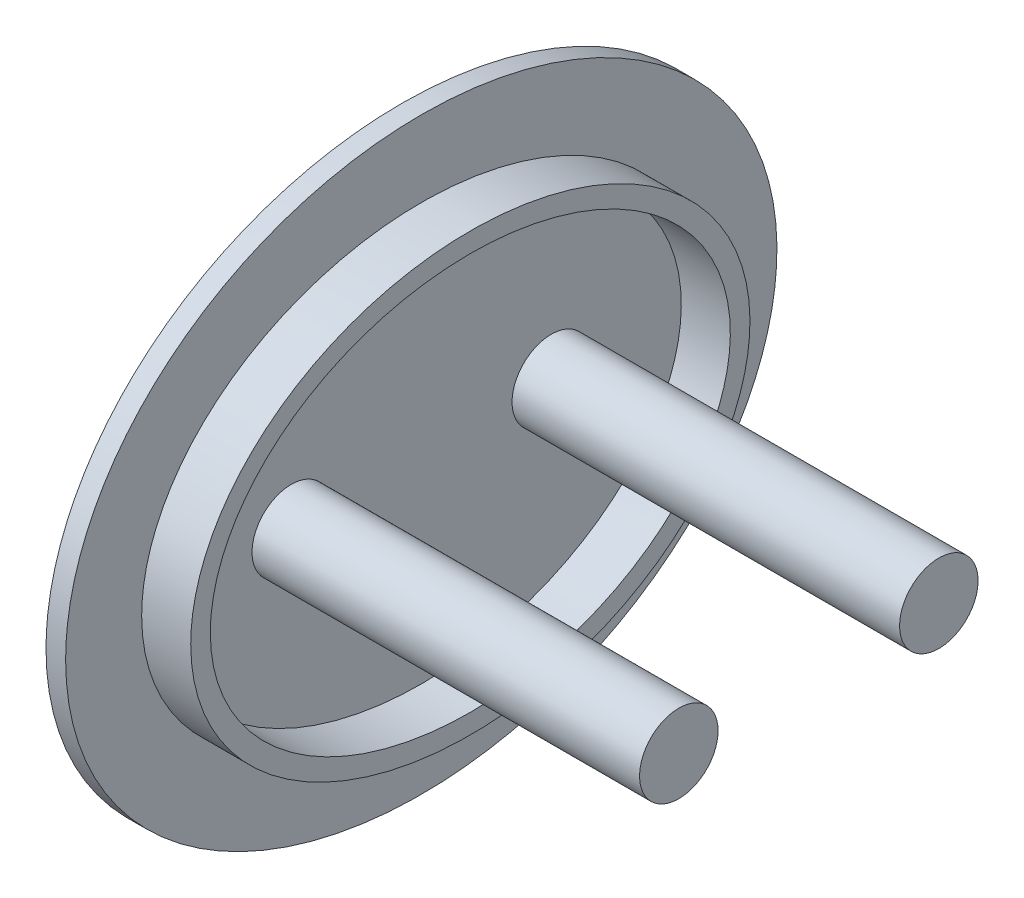
ISO-10303-21;
HEADER;
FILE_DESCRIPTION(('STEP AP214'),'2;1');
FILE_NAME('part.step','',(''),(''),'','','');
FILE_SCHEMA(('AUTOMOTIVE_DESIGN { 1 0 10303 214 1 1 1 1 }'));
ENDSEC;
DATA;
#1=APPLICATION_CONTEXT('core data for automotive mechanical design processes');
#2=APPLICATION_PROTOCOL_DEFINITION('international standard','automotive_design',2000,#1);
#3=PRODUCT_CONTEXT('',#1,'mechanical');
#4=PRODUCT('Part','Part','',(#3));
#5=PRODUCT_RELATED_PRODUCT_CATEGORY('part','',(#4));
#6=PRODUCT_DEFINITION_FORMATION('','',#4);
#7=PRODUCT_DEFINITION_CONTEXT('part definition',#1,'design');
#8=PRODUCT_DEFINITION('design','',#6,#7);
#9=PRODUCT_DEFINITION_SHAPE('','',#8);
#10=(LENGTH_UNIT() NAMED_UNIT(*) SI_UNIT(.MILLI.,.METRE.));
#11=(NAMED_UNIT(*) PLANE_ANGLE_UNIT() SI_UNIT($,.RADIAN.));
#12=(NAMED_UNIT(*) SI_UNIT($,.STERADIAN.) SOLID_ANGLE_UNIT());
#13=UNCERTAINTY_MEASURE_WITH_UNIT(LENGTH_MEASURE(1.E-05),#10,'distance_accuracy_value','');
#14=(GEOMETRIC_REPRESENTATION_CONTEXT(3) GLOBAL_UNCERTAINTY_ASSIGNED_CONTEXT((#13)) GLOBAL_UNIT_ASSIGNED_CONTEXT((#10,
#11,#12)) REPRESENTATION_CONTEXT('',''));
#15=CARTESIAN_POINT('',(0.,0.,0.));
#16=DIRECTION('',(0.,0.,1.));
#17=DIRECTION('',(1.,0.,0.));
#18=AXIS2_PLACEMENT_3D('',#15,#16,#17);
#19=CARTESIAN_POINT('',(4.,0.,0.));
#20=DIRECTION('',(1.,0.,0.));
#21=DIRECTION('',(0.,0.,-1.));
#22=AXIS2_PLACEMENT_3D('',#19,#20,#21);
#23=PLANE('',#22);
#24=CARTESIAN_POINT('',(4.,0.,0.));
#25=DIRECTION('',(1.,0.,0.));
#26=DIRECTION('',(0.,0.,1.));
#27=AXIS2_PLACEMENT_3D('',#24,#25,#26);
#28=ELLIPSE('',#27,72.5,60.);
#29=CARTESIAN_POINT('',(4.,0.,72.5));
#30=VERTEX_POINT('',#29);
#31=EDGE_CURVE('E49',#30,#30,#28,.T.);
#32=ORIENTED_EDGE('',*,*,#31,.T.);
#33=EDGE_LOOP('',(#32));
#34=FACE_BOUND('',#33,.T.);
#35=CARTESIAN_POINT('',(4.,0.,0.));
#36=DIRECTION('',(1.,0.,0.));
#37=DIRECTION('',(0.,0.,1.));
#38=AXIS2_PLACEMENT_3D('',#35,#36,#37);
#39=ELLIPSE('',#38,57.,44.5);
#40=CARTESIAN_POINT('',(4.,0.,57.));
#41=VERTEX_POINT('',#40);
#42=EDGE_CURVE('E60',#41,#41,#39,.T.);
#43=ORIENTED_EDGE('',*,*,#42,.F.);
#44=EDGE_LOOP('',(#43));
#45=FACE_BOUND('',#44,.T.);
#46=ADVANCED_FACE('F39',(#34,#45),#23,.T.);
#47=DIRECTION('',(-1.,0.,0.));
#48=VECTOR('',#47,1.);
#49=SURFACE_OF_LINEAR_EXTRUSION('',#28,#48);
#50=ORIENTED_EDGE('',*,*,#31,.F.);
#51=EDGE_LOOP('',(#50));
#52=FACE_BOUND('',#51,.T.);
#53=CARTESIAN_POINT('',(0.,0.,0.));
#54=DIRECTION('',(1.,0.,0.));
#55=DIRECTION('',(0.,0.,1.));
#56=AXIS2_PLACEMENT_3D('',#53,#54,#55);
#57=ELLIPSE('',#56,72.5,60.);
#58=CARTESIAN_POINT('',(0.,0.,72.5));
#59=VERTEX_POINT('',#58);
#60=EDGE_CURVE('E53',#59,#59,#57,.T.);
#61=ORIENTED_EDGE('',*,*,#60,.T.);
#62=EDGE_LOOP('',(#61));
#63=FACE_BOUND('',#62,.T.);
#64=ADVANCED_FACE('F41',(#52,#63),#49,.F.);
#65=CARTESIAN_POINT('',(0.,0.,0.));
#66=DIRECTION('',(1.,0.,0.));
#67=DIRECTION('',(0.,0.,-1.));
#68=AXIS2_PLACEMENT_3D('',#65,#66,#67);
#69=PLANE('',#68);
#70=ORIENTED_EDGE('',*,*,#60,.F.);
#71=EDGE_LOOP('',(#70));
#72=FACE_BOUND('',#71,.T.);
#73=ADVANCED_FACE('F84',(#72),#69,.F.);
#74=CARTESIAN_POINT('',(14.,0.,0.));
#75=DIRECTION('',(1.,0.,0.));
#76=DIRECTION('',(0.,0.,-1.));
#77=AXIS2_PLACEMENT_3D('',#74,#75,#76);
#78=PLANE('',#77);
#79=CARTESIAN_POINT('',(14.,0.,0.));
#80=DIRECTION('',(1.,0.,0.));
#81=DIRECTION('',(0.,0.,1.));
#82=AXIS2_PLACEMENT_3D('',#79,#80,#81);
#83=ELLIPSE('',#82,57.,44.5);
#84=CARTESIAN_POINT('',(14.,0.,57.));
#85=VERTEX_POINT('',#84);
#86=EDGE_CURVE('E57',#85,#85,#83,.T.);
#87=ORIENTED_EDGE('',*,*,#86,.T.);
#88=EDGE_LOOP('',(#87));
#89=FACE_BOUND('',#88,.T.);
#90=CARTESIAN_POINT('',(14.,0.,53.));
#91=CARTESIAN_POINT('',(14.,-5.15859375649566,53.));
#92=CARTESIAN_POINT('',(14.,-15.475781269487,50.3966474756641));
#93=CARTESIAN_POINT('',(14.,-29.0249422228602,38.8777487845172));
#94=CARTESIAN_POINT('',(14.,-38.3043448876993,21.1538609204162));
#95=CARTESIAN_POINT('',(14.,-41.5978275561503,0.));
#96=CARTESIAN_POINT('',(14.,-38.3043448876993,-21.1538609204162));
#97=CARTESIAN_POINT('',(14.,-29.0249422228602,-38.8777487845172));
#98=CARTESIAN_POINT('',(14.,-15.475781269487,-50.3966474756641));
#99=CARTESIAN_POINT('',(14.,0.,-54.3016762621679));
#100=CARTESIAN_POINT('',(14.,15.4757812694869,-50.3966474756641));
#101=CARTESIAN_POINT('',(14.,29.0249422228602,-38.8777487845172));
#102=CARTESIAN_POINT('',(14.,38.3043448876993,-21.1538609204162));
#103=CARTESIAN_POINT('',(14.,41.5978275561503,0.));
#104=CARTESIAN_POINT('',(14.,38.3043448876993,21.1538609204162));
#105=CARTESIAN_POINT('',(14.,29.0249422228602,38.8777487845172));
#106=CARTESIAN_POINT('',(14.,15.475781269487,50.3966474756641));
#107=CARTESIAN_POINT('',(14.,5.15859375649566,53.));
#108=CARTESIAN_POINT('',(14.,0.,53.));
#109=B_SPLINE_CURVE_WITH_KNOTS('',3,(#90,#91,#92,#93,#94,#95,#96,#97,#98,#99,#100,#101,#102,
#103,#104,#105,#106,#107,#108),.UNSPECIFIED.,.T.,.F.,(4,1,1,1,1,1,1,1,1,1,1,1,1,1,1,1,4),(0.,
0.392699081698724,0.785398163397448,1.17809724509617,1.5707963267949,1.96349540849362,
2.35619449019234,2.74889357189107,3.14159265358979,3.53429173528852,3.92699081698724,
4.31968989868597,4.71238898038469,5.10508806208341,5.49778714378214,5.89048622548086,
6.28318530717959),.UNSPECIFIED.);
#110=CARTESIAN_POINT('',(14.,0.,53.));
#111=VERTEX_POINT('',#110);
#112=EDGE_CURVE('E63',#111,#111,#109,.T.);
#113=ORIENTED_EDGE('',*,*,#112,.F.);
#114=EDGE_LOOP('',(#113));
#115=FACE_BOUND('',#114,.T.);
#116=ADVANCED_FACE('F77',(#89,#115),#78,.T.);
#117=DIRECTION('',(-1.,0.,0.));
#118=VECTOR('',#117,1.);
#119=SURFACE_OF_LINEAR_EXTRUSION('',#83,#118);
#120=ORIENTED_EDGE('',*,*,#86,.F.);
#121=EDGE_LOOP('',(#120));
#122=FACE_BOUND('',#121,.T.);
#123=ORIENTED_EDGE('',*,*,#42,.T.);
#124=EDGE_LOOP('',(#123));
#125=FACE_BOUND('',#124,.T.);
#126=ADVANCED_FACE('F72',(#122,#125),#119,.F.);
#127=DIRECTION('',(-1.,0.,0.));
#128=VECTOR('',#127,1.);
#129=SURFACE_OF_LINEAR_EXTRUSION('',#109,#128);
#130=ORIENTED_EDGE('',*,*,#112,.T.);
#131=EDGE_LOOP('',(#130));
#132=FACE_BOUND('',#131,.T.);
#133=CARTESIAN_POINT('',(4.,0.,53.));
#134=CARTESIAN_POINT('',(4.,-5.15859375649566,53.));
#135=CARTESIAN_POINT('',(4.,-15.475781269487,50.3966474756641));
#136=CARTESIAN_POINT('',(4.,-29.0249422228602,38.8777487845172));
#137=CARTESIAN_POINT('',(4.,-38.3043448876993,21.1538609204162));
#138=CARTESIAN_POINT('',(4.,-41.5978275561503,0.));
#139=CARTESIAN_POINT('',(4.,-38.3043448876993,-21.1538609204162));
#140=CARTESIAN_POINT('',(4.,-29.0249422228602,-38.8777487845172));
#141=CARTESIAN_POINT('',(4.,-15.475781269487,-50.3966474756641));
#142=CARTESIAN_POINT('',(4.,0.,-54.3016762621679));
#143=CARTESIAN_POINT('',(4.,15.4757812694869,-50.3966474756641));
#144=CARTESIAN_POINT('',(4.,29.0249422228602,-38.8777487845172));
#145=CARTESIAN_POINT('',(4.,38.3043448876993,-21.1538609204162));
#146=CARTESIAN_POINT('',(4.,41.5978275561503,0.));
#147=CARTESIAN_POINT('',(4.,38.3043448876993,21.1538609204162));
#148=CARTESIAN_POINT('',(4.,29.0249422228602,38.8777487845172));
#149=CARTESIAN_POINT('',(4.,15.475781269487,50.3966474756641));
#150=CARTESIAN_POINT('',(4.,5.15859375649566,53.));
#151=CARTESIAN_POINT('',(4.,0.,53.));
#152=B_SPLINE_CURVE_WITH_KNOTS('',3,(#133,#134,#135,#136,#137,#138,#139,#140,#141,#142,#143,
#144,#145,#146,#147,#148,#149,#150,#151),.UNSPECIFIED.,.T.,.F.,(4,1,1,1,1,1,1,1,1,1,1,1,1,1,1,1,
4),(0.,0.392699081698724,0.785398163397448,1.17809724509617,1.5707963267949,1.96349540849362,
2.35619449019234,2.74889357189107,3.14159265358979,3.53429173528852,3.92699081698724,
4.31968989868597,4.71238898038469,5.10508806208341,5.49778714378214,5.89048622548086,
6.28318530717959),.UNSPECIFIED.);
#153=CARTESIAN_POINT('',(4.,0.,53.));
#154=VERTEX_POINT('',#153);
#155=EDGE_CURVE('E10',#154,#154,#152,.F.);
#156=ORIENTED_EDGE('',*,*,#155,.T.);
#157=EDGE_LOOP('',(#156));
#158=FACE_BOUND('',#157,.T.);
#159=ADVANCED_FACE('F76',(#132,#158),#129,.T.);
#160=CARTESIAN_POINT('',(4.,0.,26.5));
#161=DIRECTION('',(1.,0.,0.));
#162=DIRECTION('',(0.,0.,-1.));
#163=AXIS2_PLACEMENT_3D('',#160,#161,#162);
#164=CIRCLE('',#163,8.);
#165=CARTESIAN_POINT('',(4.,0.,18.5));
#166=VERTEX_POINT('',#165);
#167=EDGE_CURVE('E182',#166,#166,#164,.T.);
#168=ORIENTED_EDGE('',*,*,#167,.F.);
#169=EDGE_LOOP('',(#168));
#170=FACE_BOUND('',#169,.T.);
#171=CARTESIAN_POINT('',(4.,0.,-26.5));
#172=DIRECTION('',(1.,0.,0.));
#173=DIRECTION('',(0.,0.,1.));
#174=AXIS2_PLACEMENT_3D('',#171,#172,#173);
#175=CIRCLE('',#174,8.);
#176=CARTESIAN_POINT('',(4.,0.,-18.5));
#177=VERTEX_POINT('',#176);
#178=EDGE_CURVE('E186',#177,#177,#175,.T.);
#179=ORIENTED_EDGE('',*,*,#178,.F.);
#180=EDGE_LOOP('',(#179));
#181=FACE_BOUND('',#180,.T.);
#182=ORIENTED_EDGE('',*,*,#155,.F.);
#183=EDGE_LOOP('',(#182));
#184=FACE_BOUND('',#183,.T.);
#185=ADVANCED_FACE('F80',(#170,#181,#184),#23,.T.);
#186=CARTESIAN_POINT('',(83.,0.,-26.5));
#187=DIRECTION('',(-1.,0.,0.));
#188=DIRECTION('',(0.,0.,1.));
#189=AXIS2_PLACEMENT_3D('',#186,#187,#188);
#190=CYLINDRICAL_SURFACE('',#189,8.);
#191=CARTESIAN_POINT('',(83.,0.,-26.5));
#192=DIRECTION('',(1.,0.,0.));
#193=DIRECTION('',(0.,0.,1.));
#194=AXIS2_PLACEMENT_3D('',#191,#192,#193);
#195=CIRCLE('',#194,8.);
#196=CARTESIAN_POINT('',(83.,0.,-18.5));
#197=VERTEX_POINT('',#196);
#198=EDGE_CURVE('E190',#197,#197,#195,.T.);
#199=ORIENTED_EDGE('',*,*,#198,.F.);
#200=EDGE_LOOP('',(#199));
#201=FACE_BOUND('',#200,.T.);
#202=ORIENTED_EDGE('',*,*,#178,.T.);
#203=EDGE_LOOP('',(#202));
#204=FACE_BOUND('',#203,.T.);
#205=ADVANCED_FACE('F82',(#201,#204),#190,.T.);
#206=CARTESIAN_POINT('',(83.,0.,-26.5));
#207=DIRECTION('',(-1.,0.,0.));
#208=DIRECTION('',(0.,0.,1.));
#209=AXIS2_PLACEMENT_3D('',#206,#207,#208);
#210=PLANE('',#209);
#211=ORIENTED_EDGE('',*,*,#198,.T.);
#212=EDGE_LOOP('',(#211));
#213=FACE_BOUND('',#212,.T.);
#214=ADVANCED_FACE('F130',(#213),#210,.F.);
#215=CARTESIAN_POINT('',(83.,0.,26.5));
#216=DIRECTION('',(-1.,0.,0.));
#217=DIRECTION('',(0.,0.,1.));
#218=AXIS2_PLACEMENT_3D('',#215,#216,#217);
#219=CYLINDRICAL_SURFACE('',#218,8.);
#220=CARTESIAN_POINT('',(83.,0.,26.5));
#221=DIRECTION('',(1.,0.,0.));
#222=DIRECTION('',(0.,0.,-1.));
#223=AXIS2_PLACEMENT_3D('',#220,#221,#222);
#224=CIRCLE('',#223,8.);
#225=CARTESIAN_POINT('',(83.,0.,18.5));
#226=VERTEX_POINT('',#225);
#227=EDGE_CURVE('E181',#226,#226,#224,.T.);
#228=ORIENTED_EDGE('',*,*,#227,.F.);
#229=EDGE_LOOP('',(#228));
#230=FACE_BOUND('',#229,.T.);
#231=ORIENTED_EDGE('',*,*,#167,.T.);
#232=EDGE_LOOP('',(#231));
#233=FACE_BOUND('',#232,.T.);
#234=ADVANCED_FACE('F139',(#230,#233),#219,.T.);
#235=CARTESIAN_POINT('',(83.,0.,26.5));
#236=DIRECTION('',(1.,0.,0.));
#237=DIRECTION('',(0.,0.,-1.));
#238=AXIS2_PLACEMENT_3D('',#235,#236,#237);
#239=PLANE('',#238);
#240=ORIENTED_EDGE('',*,*,#227,.T.);
#241=EDGE_LOOP('',(#240));
#242=FACE_BOUND('',#241,.T.);
#243=ADVANCED_FACE('F148',(#242),#239,.T.);
#244=CLOSED_SHELL('',(#46,#64,#73,#116,#126,#159,#185,#205,#214,#234,#243));
#245=MANIFOLD_SOLID_BREP('B2',#244);
#246=ADVANCED_BREP_SHAPE_REPRESENTATION('',(#18,#245),#14);
#247=SHAPE_DEFINITION_REPRESENTATION(#9,#246);
ENDSEC;
END-ISO-10303-21;
